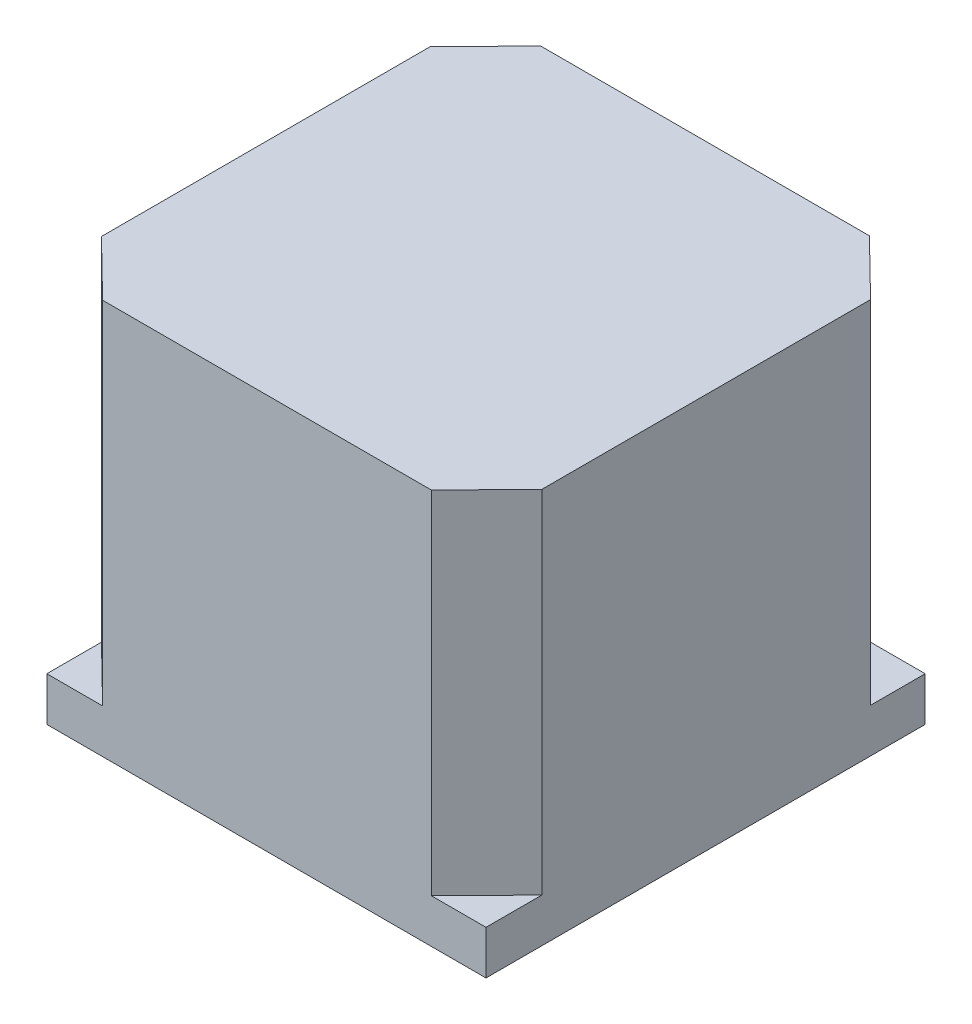
ISO-10303-21;
HEADER;
FILE_DESCRIPTION(('STEP AP214'),'2;1');
FILE_NAME('part.step','',(''),(''),'','','');
FILE_SCHEMA(('AUTOMOTIVE_DESIGN { 1 0 10303 214 1 1 1 1 }'));
ENDSEC;
DATA;
#1=APPLICATION_CONTEXT('core data for automotive mechanical design processes');
#2=APPLICATION_PROTOCOL_DEFINITION('international standard','automotive_design',2000,#1);
#3=PRODUCT_CONTEXT('',#1,'mechanical');
#4=PRODUCT('Part','Part','',(#3));
#5=PRODUCT_RELATED_PRODUCT_CATEGORY('part','',(#4));
#6=PRODUCT_DEFINITION_FORMATION('','',#4);
#7=PRODUCT_DEFINITION_CONTEXT('part definition',#1,'design');
#8=PRODUCT_DEFINITION('design','',#6,#7);
#9=PRODUCT_DEFINITION_SHAPE('','',#8);
#10=(LENGTH_UNIT() NAMED_UNIT(*) SI_UNIT(.MILLI.,.METRE.));
#11=(NAMED_UNIT(*) PLANE_ANGLE_UNIT() SI_UNIT($,.RADIAN.));
#12=(NAMED_UNIT(*) SI_UNIT($,.STERADIAN.) SOLID_ANGLE_UNIT());
#13=UNCERTAINTY_MEASURE_WITH_UNIT(LENGTH_MEASURE(1.E-05),#10,'distance_accuracy_value','');
#14=(GEOMETRIC_REPRESENTATION_CONTEXT(3) GLOBAL_UNCERTAINTY_ASSIGNED_CONTEXT((#13)) GLOBAL_UNIT_ASSIGNED_CONTEXT((#10,
#11,#12)) REPRESENTATION_CONTEXT('',''));
#15=CARTESIAN_POINT('',(0.,0.,0.));
#16=DIRECTION('',(0.,0.,1.));
#17=DIRECTION('',(1.,0.,0.));
#18=AXIS2_PLACEMENT_3D('',#15,#16,#17);
#19=CARTESIAN_POINT('',(50.,90.,50.));
#20=DIRECTION('',(-1.,0.,0.));
#21=DIRECTION('',(0.,0.,1.));
#22=AXIS2_PLACEMENT_3D('',#19,#20,#21);
#23=PLANE('',#22);
#24=DIRECTION('',(0.,0.,-1.));
#25=VECTOR('',#24,1.);
#26=CARTESIAN_POINT('',(50.,9.99999999999999,0.));
#27=LINE('',#26,#25);
#28=CARTESIAN_POINT('',(50.,9.99999999999999,-37.5567347964119));
#29=VERTEX_POINT('',#28);
#30=CARTESIAN_POINT('',(50.,9.99999999999999,-50.));
#31=VERTEX_POINT('',#30);
#32=EDGE_CURVE('E169',#29,#31,#27,.T.);
#33=ORIENTED_EDGE('',*,*,#32,.F.);
#34=DIRECTION('',(0.,1.,0.));
#35=VECTOR('',#34,1.);
#36=CARTESIAN_POINT('',(50.,9.99999999999999,-37.5567347964119));
#37=LINE('',#36,#35);
#38=CARTESIAN_POINT('',(50.,90.,-37.5567347964119));
#39=VERTEX_POINT('',#38);
#40=EDGE_CURVE('E158',#29,#39,#37,.T.);
#41=ORIENTED_EDGE('',*,*,#40,.T.);
#42=DIRECTION('',(0.,0.,-1.));
#43=VECTOR('',#42,1.);
#44=CARTESIAN_POINT('',(50.,90.,50.));
#45=LINE('',#44,#43);
#46=CARTESIAN_POINT('',(50.,90.,37.3000434710349));
#47=VERTEX_POINT('',#46);
#48=EDGE_CURVE('E190',#47,#39,#45,.T.);
#49=ORIENTED_EDGE('',*,*,#48,.F.);
#50=DIRECTION('',(0.,1.,0.));
#51=VECTOR('',#50,1.);
#52=CARTESIAN_POINT('',(50.,9.99999999999999,37.3000434710349));
#53=LINE('',#52,#51);
#54=CARTESIAN_POINT('',(50.,9.99999999999999,37.3000434710349));
#55=VERTEX_POINT('',#54);
#56=EDGE_CURVE('E156',#55,#47,#53,.T.);
#57=ORIENTED_EDGE('',*,*,#56,.F.);
#58=DIRECTION('',(0.,0.,-1.));
#59=VECTOR('',#58,1.);
#60=CARTESIAN_POINT('',(50.,9.99999999999999,0.));
#61=LINE('',#60,#59);
#62=CARTESIAN_POINT('',(50.,9.99999999999999,50.));
#63=VERTEX_POINT('',#62);
#64=EDGE_CURVE('E147',#63,#55,#61,.T.);
#65=ORIENTED_EDGE('',*,*,#64,.F.);
#66=DIRECTION('',(0.,-1.,0.));
#67=VECTOR('',#66,1.);
#68=CARTESIAN_POINT('',(50.,90.,50.));
#69=LINE('',#68,#67);
#70=CARTESIAN_POINT('',(50.,0.,50.));
#71=VERTEX_POINT('',#70);
#72=EDGE_CURVE('E201',#63,#71,#69,.T.);
#73=ORIENTED_EDGE('',*,*,#72,.T.);
#74=DIRECTION('',(0.,0.,-1.));
#75=VECTOR('',#74,1.);
#76=CARTESIAN_POINT('',(50.,0.,50.));
#77=LINE('',#76,#75);
#78=CARTESIAN_POINT('',(50.,0.,-50.));
#79=VERTEX_POINT('',#78);
#80=EDGE_CURVE('E188',#71,#79,#77,.T.);
#81=ORIENTED_EDGE('',*,*,#80,.T.);
#82=DIRECTION('',(0.,-1.,0.));
#83=VECTOR('',#82,1.);
#84=CARTESIAN_POINT('',(50.,90.,-50.));
#85=LINE('',#84,#83);
#86=EDGE_CURVE('E11',#31,#79,#85,.T.);
#87=ORIENTED_EDGE('',*,*,#86,.F.);
#88=EDGE_LOOP('',(#33,#41,#49,#57,#65,#73,#81,#87));
#89=FACE_BOUND('',#88,.T.);
#90=ADVANCED_FACE('F34',(#89),#23,.F.);
#91=CARTESIAN_POINT('',(-50.,90.,-50.));
#92=DIRECTION('',(0.,0.,1.));
#93=DIRECTION('',(1.,0.,0.));
#94=AXIS2_PLACEMENT_3D('',#91,#92,#93);
#95=PLANE('',#94);
#96=DIRECTION('',(-1.,0.,0.));
#97=VECTOR('',#96,1.);
#98=CARTESIAN_POINT('',(-50.,90.,-50.));
#99=LINE('',#98,#97);
#100=CARTESIAN_POINT('',(37.3000434710349,90.,-50.));
#101=VERTEX_POINT('',#100);
#102=CARTESIAN_POINT('',(-37.5567347964119,90.,-50.));
#103=VERTEX_POINT('',#102);
#104=EDGE_CURVE('E193',#101,#103,#99,.T.);
#105=ORIENTED_EDGE('',*,*,#104,.F.);
#106=DIRECTION('',(0.,1.,0.));
#107=VECTOR('',#106,1.);
#108=CARTESIAN_POINT('',(37.3000434710349,9.99999999999999,-50.));
#109=LINE('',#108,#107);
#110=CARTESIAN_POINT('',(37.3000434710349,9.99999999999999,-50.));
#111=VERTEX_POINT('',#110);
#112=EDGE_CURVE('E171',#111,#101,#109,.T.);
#113=ORIENTED_EDGE('',*,*,#112,.F.);
#114=DIRECTION('',(-1.,0.,0.));
#115=VECTOR('',#114,1.);
#116=CARTESIAN_POINT('',(0.,9.99999999999999,-50.));
#117=LINE('',#116,#115);
#118=EDGE_CURVE('E162',#31,#111,#117,.T.);
#119=ORIENTED_EDGE('',*,*,#118,.F.);
#120=ORIENTED_EDGE('',*,*,#86,.T.);
#121=DIRECTION('',(-1.,0.,0.));
#122=VECTOR('',#121,1.);
#123=CARTESIAN_POINT('',(-50.,0.,-50.));
#124=LINE('',#123,#122);
#125=CARTESIAN_POINT('',(-50.,0.,-50.));
#126=VERTEX_POINT('',#125);
#127=EDGE_CURVE('E204',#79,#126,#124,.T.);
#128=ORIENTED_EDGE('',*,*,#127,.T.);
#129=DIRECTION('',(0.,-1.,0.));
#130=VECTOR('',#129,1.);
#131=CARTESIAN_POINT('',(-50.,90.,-50.));
#132=LINE('',#131,#130);
#133=CARTESIAN_POINT('',(-50.,9.99999999999999,-50.));
#134=VERTEX_POINT('',#133);
#135=EDGE_CURVE('E41',#134,#126,#132,.T.);
#136=ORIENTED_EDGE('',*,*,#135,.F.);
#137=DIRECTION('',(-1.,0.,0.));
#138=VECTOR('',#137,1.);
#139=CARTESIAN_POINT('',(0.,9.99999999999999,-50.));
#140=LINE('',#139,#138);
#141=CARTESIAN_POINT('',(-37.5567347964119,9.99999999999999,-50.));
#142=VERTEX_POINT('',#141);
#143=EDGE_CURVE('E182',#142,#134,#140,.T.);
#144=ORIENTED_EDGE('',*,*,#143,.F.);
#145=DIRECTION('',(0.,1.,0.));
#146=VECTOR('',#145,1.);
#147=CARTESIAN_POINT('',(-37.5567347964119,9.99999999999999,-50.));
#148=LINE('',#147,#146);
#149=EDGE_CURVE('E185',#142,#103,#148,.T.);
#150=ORIENTED_EDGE('',*,*,#149,.T.);
#151=EDGE_LOOP('',(#105,#113,#119,#120,#128,#136,#144,#150));
#152=FACE_BOUND('',#151,.T.);
#153=ADVANCED_FACE('F224',(#152),#95,.F.);
#154=CARTESIAN_POINT('',(-50.,90.,50.));
#155=DIRECTION('',(1.,0.,0.));
#156=DIRECTION('',(0.,0.,-1.));
#157=AXIS2_PLACEMENT_3D('',#154,#155,#156);
#158=PLANE('',#157);
#159=DIRECTION('',(0.,0.,1.));
#160=VECTOR('',#159,1.);
#161=CARTESIAN_POINT('',(-50.,9.99999999999999,0.));
#162=LINE('',#161,#160);
#163=CARTESIAN_POINT('',(-50.,9.99999999999999,37.5567347964119));
#164=VERTEX_POINT('',#163);
#165=CARTESIAN_POINT('',(-50.,9.99999999999999,50.));
#166=VERTEX_POINT('',#165);
#167=EDGE_CURVE('E126',#164,#166,#162,.T.);
#168=ORIENTED_EDGE('',*,*,#167,.F.);
#169=DIRECTION('',(0.,1.,0.));
#170=VECTOR('',#169,1.);
#171=CARTESIAN_POINT('',(-50.,9.99999999999999,37.5567347964119));
#172=LINE('',#171,#170);
#173=CARTESIAN_POINT('',(-50.,90.,37.5567347964119));
#174=VERTEX_POINT('',#173);
#175=EDGE_CURVE('E123',#164,#174,#172,.T.);
#176=ORIENTED_EDGE('',*,*,#175,.T.);
#177=DIRECTION('',(0.,0.,1.));
#178=VECTOR('',#177,1.);
#179=CARTESIAN_POINT('',(-50.,90.,50.));
#180=LINE('',#179,#178);
#181=CARTESIAN_POINT('',(-50.,90.,-37.3000434710349));
#182=VERTEX_POINT('',#181);
#183=EDGE_CURVE('E197',#182,#174,#180,.T.);
#184=ORIENTED_EDGE('',*,*,#183,.F.);
#185=DIRECTION('',(0.,1.,0.));
#186=VECTOR('',#185,1.);
#187=CARTESIAN_POINT('',(-50.,9.99999999999999,-37.3000434710349));
#188=LINE('',#187,#186);
#189=CARTESIAN_POINT('',(-50.,9.99999999999999,-37.3000434710349));
#190=VERTEX_POINT('',#189);
#191=EDGE_CURVE('E56',#190,#182,#188,.T.);
#192=ORIENTED_EDGE('',*,*,#191,.F.);
#193=DIRECTION('',(0.,0.,1.));
#194=VECTOR('',#193,1.);
#195=CARTESIAN_POINT('',(-50.,9.99999999999999,0.));
#196=LINE('',#195,#194);
#197=EDGE_CURVE('E176',#134,#190,#196,.T.);
#198=ORIENTED_EDGE('',*,*,#197,.F.);
#199=ORIENTED_EDGE('',*,*,#135,.T.);
#200=DIRECTION('',(0.,0.,1.));
#201=VECTOR('',#200,1.);
#202=CARTESIAN_POINT('',(-50.,0.,50.));
#203=LINE('',#202,#201);
#204=CARTESIAN_POINT('',(-50.,0.,50.));
#205=VERTEX_POINT('',#204);
#206=EDGE_CURVE('E207',#126,#205,#203,.T.);
#207=ORIENTED_EDGE('',*,*,#206,.T.);
#208=DIRECTION('',(0.,-1.,0.));
#209=VECTOR('',#208,1.);
#210=CARTESIAN_POINT('',(-50.,90.,50.));
#211=LINE('',#210,#209);
#212=EDGE_CURVE('E213',#166,#205,#211,.T.);
#213=ORIENTED_EDGE('',*,*,#212,.F.);
#214=EDGE_LOOP('',(#168,#176,#184,#192,#198,#199,#207,#213));
#215=FACE_BOUND('',#214,.T.);
#216=ADVANCED_FACE('F217',(#215),#158,.F.);
#217=CARTESIAN_POINT('',(-50.,90.,50.));
#218=DIRECTION('',(0.,0.,-1.));
#219=DIRECTION('',(-1.,0.,0.));
#220=AXIS2_PLACEMENT_3D('',#217,#218,#219);
#221=PLANE('',#220);
#222=DIRECTION('',(1.,0.,0.));
#223=VECTOR('',#222,1.);
#224=CARTESIAN_POINT('',(0.,9.99999999999999,50.));
#225=LINE('',#224,#223);
#226=CARTESIAN_POINT('',(37.5567347964118,9.99999999999999,50.));
#227=VERTEX_POINT('',#226);
#228=EDGE_CURVE('E154',#227,#63,#225,.T.);
#229=ORIENTED_EDGE('',*,*,#228,.F.);
#230=DIRECTION('',(0.,1.,0.));
#231=VECTOR('',#230,1.);
#232=CARTESIAN_POINT('',(37.5567347964118,9.99999999999999,50.));
#233=LINE('',#232,#231);
#234=CARTESIAN_POINT('',(37.5567347964118,90.,50.));
#235=VERTEX_POINT('',#234);
#236=EDGE_CURVE('E159',#227,#235,#233,.T.);
#237=ORIENTED_EDGE('',*,*,#236,.T.);
#238=DIRECTION('',(1.,0.,0.));
#239=VECTOR('',#238,1.);
#240=CARTESIAN_POINT('',(-50.,90.,50.));
#241=LINE('',#240,#239);
#242=CARTESIAN_POINT('',(-37.300043471035,90.,50.));
#243=VERTEX_POINT('',#242);
#244=EDGE_CURVE('E140',#243,#235,#241,.T.);
#245=ORIENTED_EDGE('',*,*,#244,.F.);
#246=DIRECTION('',(0.,1.,0.));
#247=VECTOR('',#246,1.);
#248=CARTESIAN_POINT('',(-37.3000434710349,9.99999999999999,50.));
#249=LINE('',#248,#247);
#250=CARTESIAN_POINT('',(-37.3000434710349,9.99999999999999,50.));
#251=VERTEX_POINT('',#250);
#252=EDGE_CURVE('E48',#251,#243,#249,.T.);
#253=ORIENTED_EDGE('',*,*,#252,.F.);
#254=DIRECTION('',(1.,0.,0.));
#255=VECTOR('',#254,1.);
#256=CARTESIAN_POINT('',(0.,9.99999999999999,50.));
#257=LINE('',#256,#255);
#258=EDGE_CURVE('E127',#166,#251,#257,.T.);
#259=ORIENTED_EDGE('',*,*,#258,.F.);
#260=ORIENTED_EDGE('',*,*,#212,.T.);
#261=DIRECTION('',(1.,0.,0.));
#262=VECTOR('',#261,1.);
#263=CARTESIAN_POINT('',(-50.,0.,50.));
#264=LINE('',#263,#262);
#265=EDGE_CURVE('E194',#205,#71,#264,.T.);
#266=ORIENTED_EDGE('',*,*,#265,.T.);
#267=ORIENTED_EDGE('',*,*,#72,.F.);
#268=EDGE_LOOP('',(#229,#237,#245,#253,#259,#260,#266,#267));
#269=FACE_BOUND('',#268,.T.);
#270=ADVANCED_FACE('F137',(#269),#221,.F.);
#271=CARTESIAN_POINT('',(0.,90.,0.));
#272=DIRECTION('',(0.,-1.,0.));
#273=DIRECTION('',(0.,0.,-1.));
#274=AXIS2_PLACEMENT_3D('',#271,#272,#273);
#275=PLANE('',#274);
#276=ORIENTED_EDGE('',*,*,#48,.T.);
#277=DIRECTION('',(0.714288528590924,0.,0.699851339873986));
#278=VECTOR('',#277,1.);
#279=CARTESIAN_POINT('',(43.2640482738528,90.,-44.1565395702198));
#280=LINE('',#279,#278);
#281=EDGE_CURVE('E166',#101,#39,#280,.T.);
#282=ORIENTED_EDGE('',*,*,#281,.F.);
#283=ORIENTED_EDGE('',*,*,#104,.T.);
#284=DIRECTION('',(0.699851339873986,0.,-0.714288528590924));
#285=VECTOR('',#284,1.);
#286=CARTESIAN_POINT('',(-44.1565395702198,90.,-43.2640482738528));
#287=LINE('',#286,#285);
#288=EDGE_CURVE('E142',#182,#103,#287,.T.);
#289=ORIENTED_EDGE('',*,*,#288,.F.);
#290=ORIENTED_EDGE('',*,*,#183,.T.);
#291=DIRECTION('',(-0.714288528590923,0.,-0.699851339873987));
#292=VECTOR('',#291,1.);
#293=CARTESIAN_POINT('',(-43.2640482738529,90.,44.1565395702198));
#294=LINE('',#293,#292);
#295=EDGE_CURVE('E133',#243,#174,#294,.T.);
#296=ORIENTED_EDGE('',*,*,#295,.F.);
#297=ORIENTED_EDGE('',*,*,#244,.T.);
#298=DIRECTION('',(-0.699851339873987,0.,0.714288528590923));
#299=VECTOR('',#298,1.);
#300=CARTESIAN_POINT('',(44.1565395702197,90.,43.2640482738529));
#301=LINE('',#300,#299);
#302=EDGE_CURVE('E151',#47,#235,#301,.T.);
#303=ORIENTED_EDGE('',*,*,#302,.F.);
#304=EDGE_LOOP('',(#276,#282,#283,#289,#290,#296,#297,#303));
#305=FACE_BOUND('',#304,.T.);
#306=ADVANCED_FACE('F233',(#305),#275,.F.);
#307=CARTESIAN_POINT('',(0.,0.,0.));
#308=DIRECTION('',(0.,-1.,0.));
#309=DIRECTION('',(0.,0.,-1.));
#310=AXIS2_PLACEMENT_3D('',#307,#308,#309);
#311=PLANE('',#310);
#312=ORIENTED_EDGE('',*,*,#80,.F.);
#313=ORIENTED_EDGE('',*,*,#265,.F.);
#314=ORIENTED_EDGE('',*,*,#206,.F.);
#315=ORIENTED_EDGE('',*,*,#127,.F.);
#316=EDGE_LOOP('',(#312,#313,#314,#315));
#317=FACE_BOUND('',#316,.T.);
#318=ADVANCED_FACE('F229',(#317),#311,.T.);
#319=CARTESIAN_POINT('',(-44.1565395702198,9.99999999999999,-43.2640482738528));
#320=DIRECTION('',(0.714288528590924,0.,0.699851339873986));
#321=DIRECTION('',(0.699851339873986,0.,-0.714288528590924));
#322=AXIS2_PLACEMENT_3D('',#319,#320,#321);
#323=PLANE('',#322);
#324=ORIENTED_EDGE('',*,*,#288,.T.);
#325=ORIENTED_EDGE('',*,*,#149,.F.);
#326=DIRECTION('',(0.699851339873986,0.,-0.714288528590924));
#327=VECTOR('',#326,1.);
#328=CARTESIAN_POINT('',(-44.1565395702198,9.99999999999999,-43.2640482738528));
#329=LINE('',#328,#327);
#330=EDGE_CURVE('E179',#190,#142,#329,.T.);
#331=ORIENTED_EDGE('',*,*,#330,.F.);
#332=ORIENTED_EDGE('',*,*,#191,.T.);
#333=EDGE_LOOP('',(#324,#325,#331,#332));
#334=FACE_BOUND('',#333,.T.);
#335=ADVANCED_FACE('F235',(#334),#323,.F.);
#336=CARTESIAN_POINT('',(0.,9.99999999999999,0.));
#337=DIRECTION('',(0.,1.,0.));
#338=DIRECTION('',(0.,0.,1.));
#339=AXIS2_PLACEMENT_3D('',#336,#337,#338);
#340=PLANE('',#339);
#341=ORIENTED_EDGE('',*,*,#197,.T.);
#342=ORIENTED_EDGE('',*,*,#330,.T.);
#343=ORIENTED_EDGE('',*,*,#143,.T.);
#344=EDGE_LOOP('',(#341,#342,#343));
#345=FACE_BOUND('',#344,.T.);
#346=ADVANCED_FACE('F238',(#345),#340,.T.);
#347=CARTESIAN_POINT('',(-43.2640482738529,9.99999999999999,44.1565395702198));
#348=DIRECTION('',(0.699851339873986,0.,-0.714288528590923));
#349=DIRECTION('',(-0.714288528590923,0.,-0.699851339873986));
#350=AXIS2_PLACEMENT_3D('',#347,#348,#349);
#351=PLANE('',#350);
#352=ORIENTED_EDGE('',*,*,#295,.T.);
#353=ORIENTED_EDGE('',*,*,#175,.F.);
#354=DIRECTION('',(-0.714288528590923,0.,-0.699851339873987));
#355=VECTOR('',#354,1.);
#356=CARTESIAN_POINT('',(-43.2640482738529,9.99999999999999,44.1565395702198));
#357=LINE('',#356,#355);
#358=EDGE_CURVE('E119',#251,#164,#357,.T.);
#359=ORIENTED_EDGE('',*,*,#358,.F.);
#360=ORIENTED_EDGE('',*,*,#252,.T.);
#361=EDGE_LOOP('',(#352,#353,#359,#360));
#362=FACE_BOUND('',#361,.T.);
#363=ADVANCED_FACE('F121',(#362),#351,.F.);
#364=CARTESIAN_POINT('',(0.,9.99999999999999,0.));
#365=DIRECTION('',(0.,1.,0.));
#366=DIRECTION('',(0.,0.,1.));
#367=AXIS2_PLACEMENT_3D('',#364,#365,#366);
#368=PLANE('',#367);
#369=ORIENTED_EDGE('',*,*,#258,.T.);
#370=ORIENTED_EDGE('',*,*,#358,.T.);
#371=ORIENTED_EDGE('',*,*,#167,.T.);
#372=EDGE_LOOP('',(#369,#370,#371));
#373=FACE_BOUND('',#372,.T.);
#374=ADVANCED_FACE('F130',(#373),#368,.T.);
#375=CARTESIAN_POINT('',(44.1565395702197,9.99999999999999,43.2640482738529));
#376=DIRECTION('',(-0.714288528590923,0.,-0.699851339873987));
#377=DIRECTION('',(-0.699851339873987,0.,0.714288528590923));
#378=AXIS2_PLACEMENT_3D('',#375,#376,#377);
#379=PLANE('',#378);
#380=ORIENTED_EDGE('',*,*,#302,.T.);
#381=ORIENTED_EDGE('',*,*,#236,.F.);
#382=DIRECTION('',(-0.699851339873987,0.,0.714288528590923));
#383=VECTOR('',#382,1.);
#384=CARTESIAN_POINT('',(44.1565395702197,9.99999999999999,43.2640482738529));
#385=LINE('',#384,#383);
#386=EDGE_CURVE('E150',#55,#227,#385,.T.);
#387=ORIENTED_EDGE('',*,*,#386,.F.);
#388=ORIENTED_EDGE('',*,*,#56,.T.);
#389=EDGE_LOOP('',(#380,#381,#387,#388));
#390=FACE_BOUND('',#389,.T.);
#391=ADVANCED_FACE('F263',(#390),#379,.F.);
#392=CARTESIAN_POINT('',(0.,9.99999999999999,0.));
#393=DIRECTION('',(0.,1.,0.));
#394=DIRECTION('',(0.,0.,1.));
#395=AXIS2_PLACEMENT_3D('',#392,#393,#394);
#396=PLANE('',#395);
#397=ORIENTED_EDGE('',*,*,#64,.T.);
#398=ORIENTED_EDGE('',*,*,#386,.T.);
#399=ORIENTED_EDGE('',*,*,#228,.T.);
#400=EDGE_LOOP('',(#397,#398,#399));
#401=FACE_BOUND('',#400,.T.);
#402=ADVANCED_FACE('F265',(#401),#396,.T.);
#403=CARTESIAN_POINT('',(43.2640482738528,9.99999999999999,-44.1565395702198));
#404=DIRECTION('',(-0.699851339873986,0.,0.714288528590924));
#405=DIRECTION('',(0.714288528590924,0.,0.699851339873986));
#406=AXIS2_PLACEMENT_3D('',#403,#404,#405);
#407=PLANE('',#406);
#408=ORIENTED_EDGE('',*,*,#281,.T.);
#409=ORIENTED_EDGE('',*,*,#40,.F.);
#410=DIRECTION('',(0.714288528590924,0.,0.699851339873986));
#411=VECTOR('',#410,1.);
#412=CARTESIAN_POINT('',(43.2640482738528,9.99999999999999,-44.1565395702198));
#413=LINE('',#412,#411);
#414=EDGE_CURVE('E165',#111,#29,#413,.T.);
#415=ORIENTED_EDGE('',*,*,#414,.F.);
#416=ORIENTED_EDGE('',*,*,#112,.T.);
#417=EDGE_LOOP('',(#408,#409,#415,#416));
#418=FACE_BOUND('',#417,.T.);
#419=ADVANCED_FACE('F258',(#418),#407,.F.);
#420=CARTESIAN_POINT('',(0.,9.99999999999999,0.));
#421=DIRECTION('',(0.,1.,0.));
#422=DIRECTION('',(0.,0.,1.));
#423=AXIS2_PLACEMENT_3D('',#420,#421,#422);
#424=PLANE('',#423);
#425=ORIENTED_EDGE('',*,*,#118,.T.);
#426=ORIENTED_EDGE('',*,*,#414,.T.);
#427=ORIENTED_EDGE('',*,*,#32,.T.);
#428=EDGE_LOOP('',(#425,#426,#427));
#429=FACE_BOUND('',#428,.T.);
#430=ADVANCED_FACE('F256',(#429),#424,.T.);
#431=CLOSED_SHELL('',(#90,#153,#216,#270,#306,#318,#335,#346,#363,#374,#391,#402,#419,#430));
#432=MANIFOLD_SOLID_BREP('B2',#431);
#433=ADVANCED_BREP_SHAPE_REPRESENTATION('',(#18,#432),#14);
#434=SHAPE_DEFINITION_REPRESENTATION(#9,#433);
ENDSEC;
END-ISO-10303-21;
